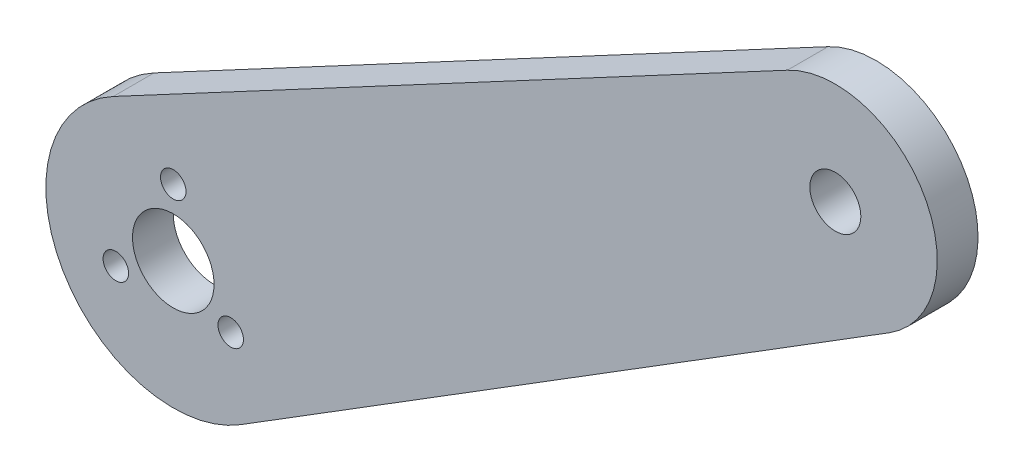
ISO-10303-21;
HEADER;
FILE_DESCRIPTION(('STEP AP214'),'2;1');
FILE_NAME('part.step','',(''),(''),'','','');
FILE_SCHEMA(('AUTOMOTIVE_DESIGN { 1 0 10303 214 1 1 1 1 }'));
ENDSEC;
DATA;
#1=APPLICATION_CONTEXT('core data for automotive mechanical design processes');
#2=APPLICATION_PROTOCOL_DEFINITION('international standard','automotive_design',2000,#1);
#3=PRODUCT_CONTEXT('',#1,'mechanical');
#4=PRODUCT('Part','Part','',(#3));
#5=PRODUCT_RELATED_PRODUCT_CATEGORY('part','',(#4));
#6=PRODUCT_DEFINITION_FORMATION('','',#4);
#7=PRODUCT_DEFINITION_CONTEXT('part definition',#1,'design');
#8=PRODUCT_DEFINITION('design','',#6,#7);
#9=PRODUCT_DEFINITION_SHAPE('','',#8);
#10=(LENGTH_UNIT() NAMED_UNIT(*) SI_UNIT(.MILLI.,.METRE.));
#11=(NAMED_UNIT(*) PLANE_ANGLE_UNIT() SI_UNIT($,.RADIAN.));
#12=(NAMED_UNIT(*) SI_UNIT($,.STERADIAN.) SOLID_ANGLE_UNIT());
#13=UNCERTAINTY_MEASURE_WITH_UNIT(LENGTH_MEASURE(1.E-05),#10,'distance_accuracy_value','');
#14=(GEOMETRIC_REPRESENTATION_CONTEXT(3) GLOBAL_UNCERTAINTY_ASSIGNED_CONTEXT((#13)) GLOBAL_UNIT_ASSIGNED_CONTEXT((#10,
#11,#12)) REPRESENTATION_CONTEXT('',''));
#15=CARTESIAN_POINT('',(0.,0.,0.));
#16=DIRECTION('',(0.,0.,1.));
#17=DIRECTION('',(1.,0.,0.));
#18=AXIS2_PLACEMENT_3D('',#15,#16,#17);
#19=CARTESIAN_POINT('',(0.,0.,4.));
#20=DIRECTION('',(0.,0.,-1.));
#21=DIRECTION('',(-1.,0.,0.));
#22=AXIS2_PLACEMENT_3D('',#19,#20,#21);
#23=CYLINDRICAL_SURFACE('',#22,12.5);
#24=CARTESIAN_POINT('',(0.,0.,0.));
#25=DIRECTION('',(0.,0.,1.));
#26=DIRECTION('',(1.,0.,0.));
#27=AXIS2_PLACEMENT_3D('',#24,#25,#26);
#28=CIRCLE('',#27,12.5);
#29=CARTESIAN_POINT('',(-5.8856828944919,11.0276351438323,0.));
#30=VERTEX_POINT('',#29);
#31=CARTESIAN_POINT('',(6.60737073097893,-10.6109684771656,0.));
#32=VERTEX_POINT('',#31);
#33=EDGE_CURVE('E115',#30,#32,#28,.T.);
#34=ORIENTED_EDGE('',*,*,#33,.T.);
#35=DIRECTION('',(0.,0.,-1.));
#36=VECTOR('',#35,1.);
#37=CARTESIAN_POINT('',(6.60737073097893,-10.6109684771656,4.));
#38=LINE('',#37,#36);
#39=CARTESIAN_POINT('',(6.60737073097893,-10.6109684771656,4.));
#40=VERTEX_POINT('',#39);
#41=EDGE_CURVE('E11',#40,#32,#38,.T.);
#42=ORIENTED_EDGE('',*,*,#41,.F.);
#43=CARTESIAN_POINT('',(0.,0.,4.));
#44=DIRECTION('',(0.,0.,1.));
#45=DIRECTION('',(1.,0.,0.));
#46=AXIS2_PLACEMENT_3D('',#43,#44,#45);
#47=CIRCLE('',#46,12.5);
#48=CARTESIAN_POINT('',(-5.8856828944919,11.0276351438323,4.));
#49=VERTEX_POINT('',#48);
#50=EDGE_CURVE('E88',#49,#40,#47,.T.);
#51=ORIENTED_EDGE('',*,*,#50,.F.);
#52=DIRECTION('',(0.,0.,-1.));
#53=VECTOR('',#52,1.);
#54=CARTESIAN_POINT('',(-5.8856828944919,11.0276351438323,4.));
#55=LINE('',#54,#53);
#56=EDGE_CURVE('E102',#49,#30,#55,.T.);
#57=ORIENTED_EDGE('',*,*,#56,.T.);
#58=EDGE_LOOP('',(#34,#42,#51,#57));
#59=FACE_BOUND('',#58,.T.);
#60=ADVANCED_FACE('F35',(#59),#23,.T.);
#61=CARTESIAN_POINT('',(6.60737073097893,-10.6109684771657,4.));
#62=DIRECTION('',(-0.528589658478314,0.848877478173252,0.));
#63=DIRECTION('',(-0.848877478173252,-0.528589658478314,0.));
#64=AXIS2_PLACEMENT_3D('',#61,#62,#63);
#65=PLANE('',#64);
#66=DIRECTION('',(0.848877478173252,0.528589658478314,0.));
#67=VECTOR('',#66,1.);
#68=CARTESIAN_POINT('',(6.60737073097893,-10.6109684771657,0.));
#69=LINE('',#68,#67);
#70=CARTESIAN_POINT('',(70.237801868616,29.0112252182676,0.));
#71=VERTEX_POINT('',#70);
#72=EDGE_CURVE('E92',#32,#71,#69,.T.);
#73=ORIENTED_EDGE('',*,*,#72,.T.);
#74=DIRECTION('',(0.,0.,-1.));
#75=VECTOR('',#74,1.);
#76=CARTESIAN_POINT('',(70.237801868616,29.0112252182676,4.));
#77=LINE('',#76,#75);
#78=CARTESIAN_POINT('',(70.237801868616,29.0112252182676,4.));
#79=VERTEX_POINT('',#78);
#80=EDGE_CURVE('E44',#79,#71,#77,.T.);
#81=ORIENTED_EDGE('',*,*,#80,.F.);
#82=DIRECTION('',(0.848877478173252,0.528589658478314,0.));
#83=VECTOR('',#82,1.);
#84=CARTESIAN_POINT('',(6.60737073097893,-10.6109684771657,4.));
#85=LINE('',#84,#83);
#86=EDGE_CURVE('E82',#40,#79,#85,.T.);
#87=ORIENTED_EDGE('',*,*,#86,.F.);
#88=ORIENTED_EDGE('',*,*,#41,.T.);
#89=EDGE_LOOP('',(#73,#81,#87,#88));
#90=FACE_BOUND('',#89,.T.);
#91=ADVANCED_FACE('F91',(#90),#65,.F.);
#92=CARTESIAN_POINT('',(64.9519052838328,37.5000000000001,4.));
#93=DIRECTION('',(0.,0.,-1.));
#94=DIRECTION('',(-1.,0.,0.));
#95=AXIS2_PLACEMENT_3D('',#92,#93,#94);
#96=CYLINDRICAL_SURFACE('',#95,9.99999999999999);
#97=CARTESIAN_POINT('',(64.9519052838328,37.5000000000001,0.));
#98=DIRECTION('',(0.,0.,1.));
#99=DIRECTION('',(1.,0.,0.));
#100=AXIS2_PLACEMENT_3D('',#97,#98,#99);
#101=CIRCLE('',#100,9.99999999999999);
#102=CARTESIAN_POINT('',(60.2433589682394,46.322108115066,0.));
#103=VERTEX_POINT('',#102);
#104=EDGE_CURVE('E69',#71,#103,#101,.T.);
#105=ORIENTED_EDGE('',*,*,#104,.T.);
#106=DIRECTION('',(0.,0.,-1.));
#107=VECTOR('',#106,1.);
#108=CARTESIAN_POINT('',(60.2433589682394,46.322108115066,4.));
#109=LINE('',#108,#107);
#110=CARTESIAN_POINT('',(60.2433589682394,46.322108115066,4.));
#111=VERTEX_POINT('',#110);
#112=EDGE_CURVE('E93',#111,#103,#109,.T.);
#113=ORIENTED_EDGE('',*,*,#112,.F.);
#114=CARTESIAN_POINT('',(64.9519052838328,37.5000000000001,4.));
#115=DIRECTION('',(0.,0.,1.));
#116=DIRECTION('',(1.,0.,0.));
#117=AXIS2_PLACEMENT_3D('',#114,#115,#116);
#118=CIRCLE('',#117,9.99999999999999);
#119=EDGE_CURVE('E86',#79,#111,#118,.T.);
#120=ORIENTED_EDGE('',*,*,#119,.F.);
#121=ORIENTED_EDGE('',*,*,#80,.T.);
#122=EDGE_LOOP('',(#105,#113,#120,#121));
#123=FACE_BOUND('',#122,.T.);
#124=ADVANCED_FACE('F94',(#123),#96,.T.);
#125=CARTESIAN_POINT('',(-5.88568289449189,11.0276351438323,4.));
#126=DIRECTION('',(0.470854631559352,-0.882210811506585,0.));
#127=DIRECTION('',(0.882210811506585,0.470854631559352,0.));
#128=AXIS2_PLACEMENT_3D('',#125,#126,#127);
#129=PLANE('',#128);
#130=DIRECTION('',(-0.882210811506585,-0.470854631559352,0.));
#131=VECTOR('',#130,1.);
#132=CARTESIAN_POINT('',(-5.88568289449189,11.0276351438323,0.));
#133=LINE('',#132,#131);
#134=EDGE_CURVE('E75',#103,#30,#133,.T.);
#135=ORIENTED_EDGE('',*,*,#134,.T.);
#136=ORIENTED_EDGE('',*,*,#56,.F.);
#137=DIRECTION('',(-0.882210811506585,-0.470854631559352,0.));
#138=VECTOR('',#137,1.);
#139=CARTESIAN_POINT('',(-5.88568289449189,11.0276351438323,4.));
#140=LINE('',#139,#138);
#141=EDGE_CURVE('E52',#111,#49,#140,.T.);
#142=ORIENTED_EDGE('',*,*,#141,.F.);
#143=ORIENTED_EDGE('',*,*,#112,.T.);
#144=EDGE_LOOP('',(#135,#136,#142,#143));
#145=FACE_BOUND('',#144,.T.);
#146=ADVANCED_FACE('F126',(#145),#129,.F.);
#147=CARTESIAN_POINT('',(-5.63384370309227,-3.25270117855261,4.));
#148=DIRECTION('',(0.,0.,-1.));
#149=DIRECTION('',(-1.,0.,0.));
#150=AXIS2_PLACEMENT_3D('',#147,#148,#149);
#151=CYLINDRICAL_SURFACE('',#150,1.25);
#152=CARTESIAN_POINT('',(-5.63384370309227,-3.25270117855261,4.));
#153=DIRECTION('',(0.,0.,1.));
#154=DIRECTION('',(1.,0.,0.));
#155=AXIS2_PLACEMENT_3D('',#152,#153,#154);
#156=CIRCLE('',#155,1.25);
#157=CARTESIAN_POINT('',(-4.38384370309227,-3.25270117855261,4.));
#158=VERTEX_POINT('',#157);
#159=EDGE_CURVE('E132',#158,#158,#156,.T.);
#160=ORIENTED_EDGE('',*,*,#159,.T.);
#161=EDGE_LOOP('',(#160));
#162=FACE_BOUND('',#161,.T.);
#163=CARTESIAN_POINT('',(-5.63384370309227,-3.25270117855261,0.));
#164=DIRECTION('',(0.,0.,1.));
#165=DIRECTION('',(1.,0.,0.));
#166=AXIS2_PLACEMENT_3D('',#163,#164,#165);
#167=CIRCLE('',#166,1.25);
#168=CARTESIAN_POINT('',(-4.38384370309227,-3.25270117855261,0.));
#169=VERTEX_POINT('',#168);
#170=EDGE_CURVE('E112',#169,#169,#167,.T.);
#171=ORIENTED_EDGE('',*,*,#170,.F.);
#172=EDGE_LOOP('',(#171));
#173=FACE_BOUND('',#172,.T.);
#174=ADVANCED_FACE('F157',(#162,#173),#151,.F.);
#175=CARTESIAN_POINT('',(5.63384370309228,-3.25270117855259,4.));
#176=DIRECTION('',(0.,0.,-1.));
#177=DIRECTION('',(-1.,0.,0.));
#178=AXIS2_PLACEMENT_3D('',#175,#176,#177);
#179=CYLINDRICAL_SURFACE('',#178,1.25);
#180=CARTESIAN_POINT('',(5.63384370309228,-3.25270117855259,4.));
#181=DIRECTION('',(0.,0.,1.));
#182=DIRECTION('',(1.,0.,0.));
#183=AXIS2_PLACEMENT_3D('',#180,#181,#182);
#184=CIRCLE('',#183,1.25);
#185=CARTESIAN_POINT('',(6.88384370309228,-3.25270117855259,4.));
#186=VERTEX_POINT('',#185);
#187=EDGE_CURVE('E134',#186,#186,#184,.T.);
#188=ORIENTED_EDGE('',*,*,#187,.T.);
#189=EDGE_LOOP('',(#188));
#190=FACE_BOUND('',#189,.T.);
#191=CARTESIAN_POINT('',(5.63384370309228,-3.25270117855259,0.));
#192=DIRECTION('',(0.,0.,1.));
#193=DIRECTION('',(1.,0.,0.));
#194=AXIS2_PLACEMENT_3D('',#191,#192,#193);
#195=CIRCLE('',#194,1.25);
#196=CARTESIAN_POINT('',(6.88384370309228,-3.25270117855259,0.));
#197=VERTEX_POINT('',#196);
#198=EDGE_CURVE('E109',#197,#197,#195,.T.);
#199=ORIENTED_EDGE('',*,*,#198,.F.);
#200=EDGE_LOOP('',(#199));
#201=FACE_BOUND('',#200,.T.);
#202=ADVANCED_FACE('F160',(#190,#201),#179,.F.);
#203=CARTESIAN_POINT('',(0.,6.50540235710521,4.));
#204=DIRECTION('',(0.,0.,-1.));
#205=DIRECTION('',(-1.,0.,0.));
#206=AXIS2_PLACEMENT_3D('',#203,#204,#205);
#207=CYLINDRICAL_SURFACE('',#206,1.25);
#208=CARTESIAN_POINT('',(0.,6.50540235710521,4.));
#209=DIRECTION('',(0.,0.,1.));
#210=DIRECTION('',(1.,0.,0.));
#211=AXIS2_PLACEMENT_3D('',#208,#209,#210);
#212=CIRCLE('',#211,1.25);
#213=CARTESIAN_POINT('',(1.24999999999999,6.50540235710521,4.));
#214=VERTEX_POINT('',#213);
#215=EDGE_CURVE('E139',#214,#214,#212,.T.);
#216=ORIENTED_EDGE('',*,*,#215,.T.);
#217=EDGE_LOOP('',(#216));
#218=FACE_BOUND('',#217,.T.);
#219=CARTESIAN_POINT('',(0.,6.50540235710521,0.));
#220=DIRECTION('',(0.,0.,1.));
#221=DIRECTION('',(1.,0.,0.));
#222=AXIS2_PLACEMENT_3D('',#219,#220,#221);
#223=CIRCLE('',#222,1.25);
#224=CARTESIAN_POINT('',(1.24999999999999,6.50540235710521,0.));
#225=VERTEX_POINT('',#224);
#226=EDGE_CURVE('E106',#225,#225,#223,.T.);
#227=ORIENTED_EDGE('',*,*,#226,.F.);
#228=EDGE_LOOP('',(#227));
#229=FACE_BOUND('',#228,.T.);
#230=ADVANCED_FACE('F180',(#218,#229),#207,.F.);
#231=CARTESIAN_POINT('',(0.,0.,4.));
#232=DIRECTION('',(0.,0.,-1.));
#233=DIRECTION('',(-1.,0.,0.));
#234=AXIS2_PLACEMENT_3D('',#231,#232,#233);
#235=CYLINDRICAL_SURFACE('',#234,4.);
#236=CARTESIAN_POINT('',(0.,0.,4.));
#237=DIRECTION('',(0.,0.,1.));
#238=DIRECTION('',(1.,0.,0.));
#239=AXIS2_PLACEMENT_3D('',#236,#237,#238);
#240=CIRCLE('',#239,4.);
#241=CARTESIAN_POINT('',(4.,0.,4.));
#242=VERTEX_POINT('',#241);
#243=EDGE_CURVE('E124',#242,#242,#240,.T.);
#244=ORIENTED_EDGE('',*,*,#243,.T.);
#245=EDGE_LOOP('',(#244));
#246=FACE_BOUND('',#245,.T.);
#247=CARTESIAN_POINT('',(0.,0.,0.));
#248=DIRECTION('',(0.,0.,1.));
#249=DIRECTION('',(1.,0.,0.));
#250=AXIS2_PLACEMENT_3D('',#247,#248,#249);
#251=CIRCLE('',#250,4.);
#252=CARTESIAN_POINT('',(4.,0.,0.));
#253=VERTEX_POINT('',#252);
#254=EDGE_CURVE('E103',#253,#253,#251,.T.);
#255=ORIENTED_EDGE('',*,*,#254,.F.);
#256=EDGE_LOOP('',(#255));
#257=FACE_BOUND('',#256,.T.);
#258=ADVANCED_FACE('F37',(#246,#257),#235,.F.);
#259=CARTESIAN_POINT('',(64.9519052838328,37.5000000000001,4.));
#260=DIRECTION('',(0.,0.,-1.));
#261=DIRECTION('',(-1.,0.,0.));
#262=AXIS2_PLACEMENT_3D('',#259,#260,#261);
#263=CYLINDRICAL_SURFACE('',#262,2.5);
#264=CARTESIAN_POINT('',(64.9519052838328,37.5000000000001,4.));
#265=DIRECTION('',(0.,0.,1.));
#266=DIRECTION('',(1.,0.,0.));
#267=AXIS2_PLACEMENT_3D('',#264,#265,#266);
#268=CIRCLE('',#267,2.5);
#269=CARTESIAN_POINT('',(67.4519052838329,37.5000000000001,4.));
#270=VERTEX_POINT('',#269);
#271=EDGE_CURVE('E96',#270,#270,#268,.T.);
#272=ORIENTED_EDGE('',*,*,#271,.T.);
#273=EDGE_LOOP('',(#272));
#274=FACE_BOUND('',#273,.T.);
#275=CARTESIAN_POINT('',(64.9519052838328,37.5000000000001,0.));
#276=DIRECTION('',(0.,0.,1.));
#277=DIRECTION('',(1.,0.,0.));
#278=AXIS2_PLACEMENT_3D('',#275,#276,#277);
#279=CIRCLE('',#278,2.5);
#280=CARTESIAN_POINT('',(67.4519052838329,37.5000000000001,0.));
#281=VERTEX_POINT('',#280);
#282=EDGE_CURVE('E121',#281,#281,#279,.T.);
#283=ORIENTED_EDGE('',*,*,#282,.F.);
#284=EDGE_LOOP('',(#283));
#285=FACE_BOUND('',#284,.T.);
#286=ADVANCED_FACE('F149',(#274,#285),#263,.F.);
#287=CARTESIAN_POINT('',(0.,0.,4.));
#288=DIRECTION('',(0.,0.,1.));
#289=DIRECTION('',(1.,0.,0.));
#290=AXIS2_PLACEMENT_3D('',#287,#288,#289);
#291=PLANE('',#290);
#292=ORIENTED_EDGE('',*,*,#243,.F.);
#293=EDGE_LOOP('',(#292));
#294=FACE_BOUND('',#293,.T.);
#295=ORIENTED_EDGE('',*,*,#215,.F.);
#296=EDGE_LOOP('',(#295));
#297=FACE_BOUND('',#296,.T.);
#298=ORIENTED_EDGE('',*,*,#187,.F.);
#299=EDGE_LOOP('',(#298));
#300=FACE_BOUND('',#299,.T.);
#301=ORIENTED_EDGE('',*,*,#159,.F.);
#302=EDGE_LOOP('',(#301));
#303=FACE_BOUND('',#302,.T.);
#304=ORIENTED_EDGE('',*,*,#50,.T.);
#305=ORIENTED_EDGE('',*,*,#86,.T.);
#306=ORIENTED_EDGE('',*,*,#119,.T.);
#307=ORIENTED_EDGE('',*,*,#141,.T.);
#308=EDGE_LOOP('',(#304,#305,#306,#307));
#309=FACE_BOUND('',#308,.T.);
#310=ORIENTED_EDGE('',*,*,#271,.F.);
#311=EDGE_LOOP('',(#310));
#312=FACE_BOUND('',#311,.T.);
#313=ADVANCED_FACE('F83',(#294,#297,#300,#303,#309,#312),#291,.T.);
#314=CARTESIAN_POINT('',(0.,0.,0.));
#315=DIRECTION('',(0.,0.,1.));
#316=DIRECTION('',(1.,0.,0.));
#317=AXIS2_PLACEMENT_3D('',#314,#315,#316);
#318=PLANE('',#317);
#319=ORIENTED_EDGE('',*,*,#254,.T.);
#320=EDGE_LOOP('',(#319));
#321=FACE_BOUND('',#320,.T.);
#322=ORIENTED_EDGE('',*,*,#226,.T.);
#323=EDGE_LOOP('',(#322));
#324=FACE_BOUND('',#323,.T.);
#325=ORIENTED_EDGE('',*,*,#198,.T.);
#326=EDGE_LOOP('',(#325));
#327=FACE_BOUND('',#326,.T.);
#328=ORIENTED_EDGE('',*,*,#170,.T.);
#329=EDGE_LOOP('',(#328));
#330=FACE_BOUND('',#329,.T.);
#331=ORIENTED_EDGE('',*,*,#33,.F.);
#332=ORIENTED_EDGE('',*,*,#134,.F.);
#333=ORIENTED_EDGE('',*,*,#104,.F.);
#334=ORIENTED_EDGE('',*,*,#72,.F.);
#335=EDGE_LOOP('',(#331,#332,#333,#334));
#336=FACE_BOUND('',#335,.T.);
#337=ORIENTED_EDGE('',*,*,#282,.T.);
#338=EDGE_LOOP('',(#337));
#339=FACE_BOUND('',#338,.T.);
#340=ADVANCED_FACE('F129',(#321,#324,#327,#330,#336,#339),#318,.F.);
#341=CLOSED_SHELL('',(#60,#91,#124,#146,#174,#202,#230,#258,#286,#313,#340));
#342=MANIFOLD_SOLID_BREP('B2',#341);
#343=ADVANCED_BREP_SHAPE_REPRESENTATION('',(#18,#342),#14);
#344=SHAPE_DEFINITION_REPRESENTATION(#9,#343);
ENDSEC;
END-ISO-10303-21;
